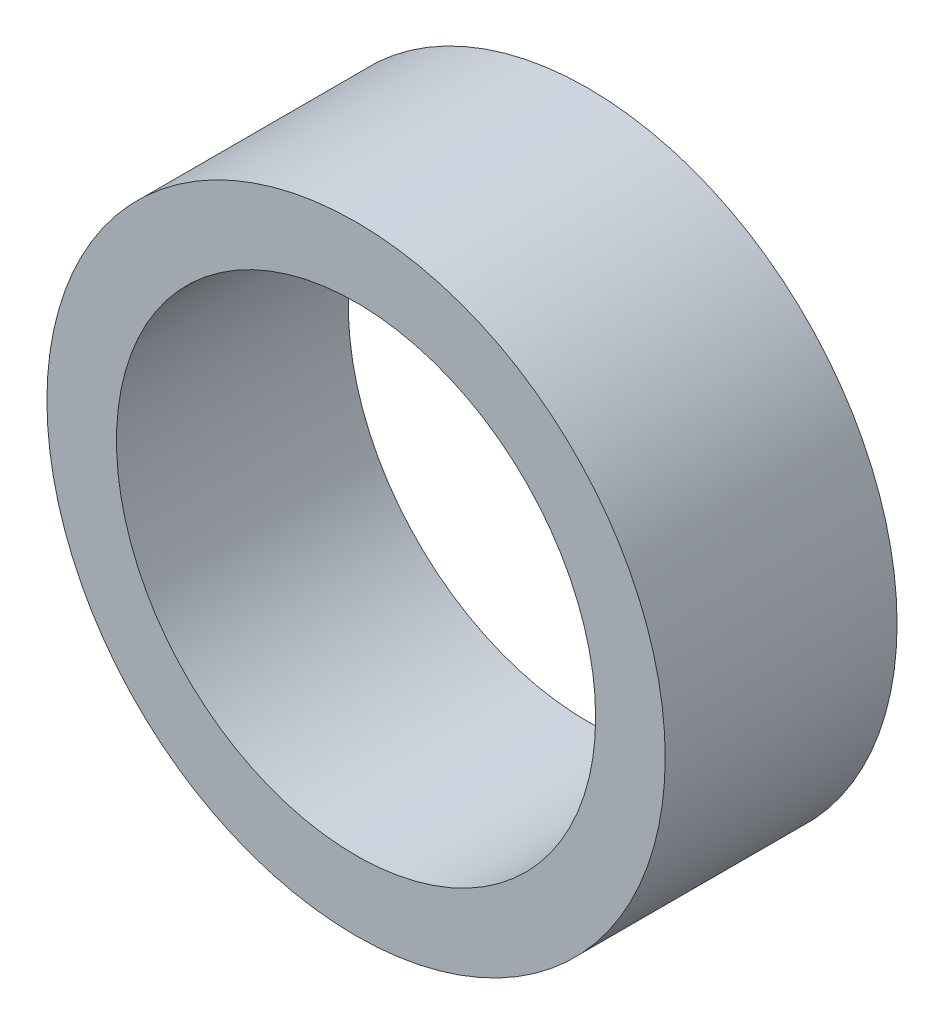
ISO-10303-21;
HEADER;
FILE_DESCRIPTION(('STEP AP214'),'2;1');
FILE_NAME('part.step','',(''),(''),'','','');
FILE_SCHEMA(('AUTOMOTIVE_DESIGN { 1 0 10303 214 1 1 1 1 }'));
ENDSEC;
DATA;
#1=APPLICATION_CONTEXT('core data for automotive mechanical design processes');
#2=APPLICATION_PROTOCOL_DEFINITION('international standard','automotive_design',2000,#1);
#3=PRODUCT_CONTEXT('',#1,'mechanical');
#4=PRODUCT('Part','Part','',(#3));
#5=PRODUCT_RELATED_PRODUCT_CATEGORY('part','',(#4));
#6=PRODUCT_DEFINITION_FORMATION('','',#4);
#7=PRODUCT_DEFINITION_CONTEXT('part definition',#1,'design');
#8=PRODUCT_DEFINITION('design','',#6,#7);
#9=PRODUCT_DEFINITION_SHAPE('','',#8);
#10=(LENGTH_UNIT() NAMED_UNIT(*) SI_UNIT(.MILLI.,.METRE.));
#11=(NAMED_UNIT(*) PLANE_ANGLE_UNIT() SI_UNIT($,.RADIAN.));
#12=(NAMED_UNIT(*) SI_UNIT($,.STERADIAN.) SOLID_ANGLE_UNIT());
#13=UNCERTAINTY_MEASURE_WITH_UNIT(LENGTH_MEASURE(1.E-05),#10,'distance_accuracy_value','');
#14=(GEOMETRIC_REPRESENTATION_CONTEXT(3) GLOBAL_UNCERTAINTY_ASSIGNED_CONTEXT((#13)) GLOBAL_UNIT_ASSIGNED_CONTEXT((#10,
#11,#12)) REPRESENTATION_CONTEXT('',''));
#15=CARTESIAN_POINT('',(0.,0.,0.));
#16=DIRECTION('',(0.,0.,1.));
#17=DIRECTION('',(1.,0.,0.));
#18=AXIS2_PLACEMENT_3D('',#15,#16,#17);
#19=CARTESIAN_POINT('',(0.,0.,3.));
#20=DIRECTION('',(0.,0.,1.));
#21=DIRECTION('',(1.,0.,0.));
#22=AXIS2_PLACEMENT_3D('',#19,#20,#21);
#23=PLANE('',#22);
#24=CARTESIAN_POINT('',(0.,0.,3.));
#25=DIRECTION('',(0.,0.,1.));
#26=DIRECTION('',(1.,0.,0.));
#27=AXIS2_PLACEMENT_3D('',#24,#25,#26);
#28=CIRCLE('',#27,4.);
#29=CARTESIAN_POINT('',(4.,0.,3.));
#30=VERTEX_POINT('',#29);
#31=EDGE_CURVE('E10',#30,#30,#28,.T.);
#32=ORIENTED_EDGE('',*,*,#31,.T.);
#33=EDGE_LOOP('',(#32));
#34=FACE_BOUND('',#33,.T.);
#35=CARTESIAN_POINT('',(0.,0.,3.));
#36=DIRECTION('',(0.,0.,1.));
#37=DIRECTION('',(1.,0.,0.));
#38=AXIS2_PLACEMENT_3D('',#35,#36,#37);
#39=CIRCLE('',#38,3.1);
#40=CARTESIAN_POINT('',(3.1,0.,3.));
#41=VERTEX_POINT('',#40);
#42=EDGE_CURVE('E42',#41,#41,#39,.T.);
#43=ORIENTED_EDGE('',*,*,#42,.F.);
#44=EDGE_LOOP('',(#43));
#45=FACE_BOUND('',#44,.T.);
#46=ADVANCED_FACE('F31',(#34,#45),#23,.T.);
#47=CARTESIAN_POINT('',(0.,0.,0.));
#48=DIRECTION('',(0.,0.,1.));
#49=DIRECTION('',(1.,0.,0.));
#50=AXIS2_PLACEMENT_3D('',#47,#48,#49);
#51=PLANE('',#50);
#52=CARTESIAN_POINT('',(0.,0.,0.));
#53=DIRECTION('',(0.,0.,1.));
#54=DIRECTION('',(1.,0.,0.));
#55=AXIS2_PLACEMENT_3D('',#52,#53,#54);
#56=CIRCLE('',#55,4.);
#57=CARTESIAN_POINT('',(4.,0.,0.));
#58=VERTEX_POINT('',#57);
#59=EDGE_CURVE('E35',#58,#58,#56,.T.);
#60=ORIENTED_EDGE('',*,*,#59,.F.);
#61=EDGE_LOOP('',(#60));
#62=FACE_BOUND('',#61,.T.);
#63=CARTESIAN_POINT('',(0.,0.,0.));
#64=DIRECTION('',(0.,0.,1.));
#65=DIRECTION('',(1.,0.,0.));
#66=AXIS2_PLACEMENT_3D('',#63,#64,#65);
#67=CIRCLE('',#66,3.1);
#68=CARTESIAN_POINT('',(3.1,0.,0.));
#69=VERTEX_POINT('',#68);
#70=EDGE_CURVE('E44',#69,#69,#67,.T.);
#71=ORIENTED_EDGE('',*,*,#70,.T.);
#72=EDGE_LOOP('',(#71));
#73=FACE_BOUND('',#72,.T.);
#74=ADVANCED_FACE('F54',(#62,#73),#51,.F.);
#75=CARTESIAN_POINT('',(0.,0.,3.));
#76=DIRECTION('',(0.,0.,-1.));
#77=DIRECTION('',(-1.,0.,0.));
#78=AXIS2_PLACEMENT_3D('',#75,#76,#77);
#79=CYLINDRICAL_SURFACE('',#78,4.);
#80=ORIENTED_EDGE('',*,*,#31,.F.);
#81=EDGE_LOOP('',(#80));
#82=FACE_BOUND('',#81,.T.);
#83=ORIENTED_EDGE('',*,*,#59,.T.);
#84=EDGE_LOOP('',(#83));
#85=FACE_BOUND('',#84,.T.);
#86=ADVANCED_FACE('F33',(#82,#85),#79,.T.);
#87=CARTESIAN_POINT('',(0.,0.,3.));
#88=DIRECTION('',(0.,0.,-1.));
#89=DIRECTION('',(-1.,0.,0.));
#90=AXIS2_PLACEMENT_3D('',#87,#88,#89);
#91=CYLINDRICAL_SURFACE('',#90,3.1);
#92=ORIENTED_EDGE('',*,*,#42,.T.);
#93=EDGE_LOOP('',(#92));
#94=FACE_BOUND('',#93,.T.);
#95=ORIENTED_EDGE('',*,*,#70,.F.);
#96=EDGE_LOOP('',(#95));
#97=FACE_BOUND('',#96,.T.);
#98=ADVANCED_FACE('F50',(#94,#97),#91,.F.);
#99=CLOSED_SHELL('',(#46,#74,#86,#98));
#100=MANIFOLD_SOLID_BREP('B2',#99);
#101=ADVANCED_BREP_SHAPE_REPRESENTATION('',(#18,#100),#14);
#102=SHAPE_DEFINITION_REPRESENTATION(#9,#101);
ENDSEC;
END-ISO-10303-21;
